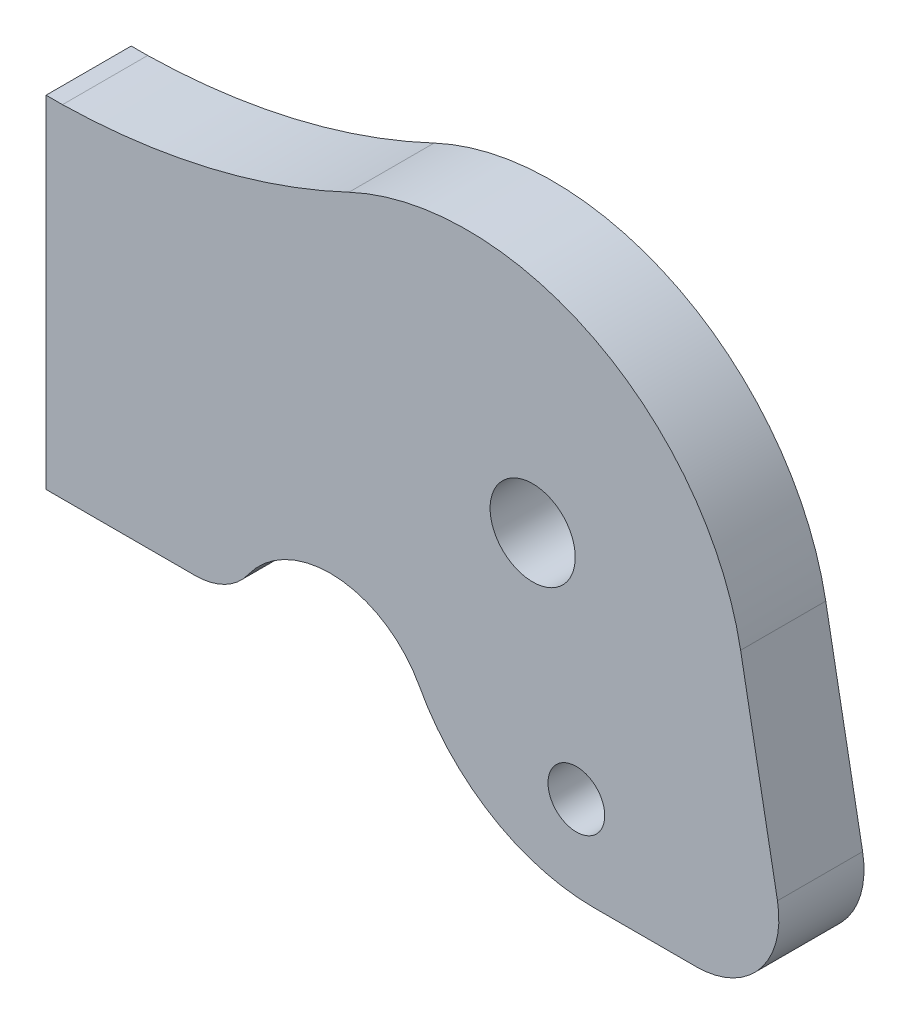
ISO-10303-21;
HEADER;
FILE_DESCRIPTION(('STEP AP214'),'2;1');
FILE_NAME('part.step','',(''),(''),'','','');
FILE_SCHEMA(('AUTOMOTIVE_DESIGN { 1 0 10303 214 1 1 1 1 }'));
ENDSEC;
DATA;
#1=APPLICATION_CONTEXT('core data for automotive mechanical design processes');
#2=APPLICATION_PROTOCOL_DEFINITION('international standard','automotive_design',2000,#1);
#3=PRODUCT_CONTEXT('',#1,'mechanical');
#4=PRODUCT('Part','Part','',(#3));
#5=PRODUCT_RELATED_PRODUCT_CATEGORY('part','',(#4));
#6=PRODUCT_DEFINITION_FORMATION('','',#4);
#7=PRODUCT_DEFINITION_CONTEXT('part definition',#1,'design');
#8=PRODUCT_DEFINITION('design','',#6,#7);
#9=PRODUCT_DEFINITION_SHAPE('','',#8);
#10=(LENGTH_UNIT() NAMED_UNIT(*) SI_UNIT(.MILLI.,.METRE.));
#11=(NAMED_UNIT(*) PLANE_ANGLE_UNIT() SI_UNIT($,.RADIAN.));
#12=(NAMED_UNIT(*) SI_UNIT($,.STERADIAN.) SOLID_ANGLE_UNIT());
#13=UNCERTAINTY_MEASURE_WITH_UNIT(LENGTH_MEASURE(1.E-05),#10,'distance_accuracy_value','');
#14=(GEOMETRIC_REPRESENTATION_CONTEXT(3) GLOBAL_UNCERTAINTY_ASSIGNED_CONTEXT((#13)) GLOBAL_UNIT_ASSIGNED_CONTEXT((#10,
#11,#12)) REPRESENTATION_CONTEXT('',''));
#15=CARTESIAN_POINT('',(0.,0.,0.));
#16=DIRECTION('',(0.,0.,1.));
#17=DIRECTION('',(1.,0.,0.));
#18=AXIS2_PLACEMENT_3D('',#15,#16,#17);
#19=CARTESIAN_POINT('',(-18.8116514005314,31.4423650959281,3.));
#20=DIRECTION('',(0.,0.,-1.));
#21=DIRECTION('',(-1.,0.,0.));
#22=AXIS2_PLACEMENT_3D('',#19,#20,#21);
#23=CYLINDRICAL_SURFACE('',#22,24.7241898311475);
#24=CARTESIAN_POINT('',(-18.8116514005314,31.4423650959281,0.));
#25=DIRECTION('',(0.,0.,1.));
#26=DIRECTION('',(1.,0.,0.));
#27=AXIS2_PLACEMENT_3D('',#24,#25,#26);
#28=CIRCLE('',#27,24.7241898311475);
#29=CARTESIAN_POINT('',(-18.3219339744752,6.72302571055551,0.));
#30=VERTEX_POINT('',#29);
#31=CARTESIAN_POINT('',(-8.23069141279537,9.09669776320907,0.));
#32=VERTEX_POINT('',#31);
#33=EDGE_CURVE('E152',#30,#32,#28,.T.);
#34=ORIENTED_EDGE('',*,*,#33,.F.);
#35=DIRECTION('',(0.,0.,-1.));
#36=VECTOR('',#35,1.);
#37=CARTESIAN_POINT('',(-18.3219339744752,6.72302571055551,3.));
#38=LINE('',#37,#36);
#39=CARTESIAN_POINT('',(-18.3219339744752,6.72302571055551,3.));
#40=VERTEX_POINT('',#39);
#41=EDGE_CURVE('E11',#40,#30,#38,.T.);
#42=ORIENTED_EDGE('',*,*,#41,.F.);
#43=CARTESIAN_POINT('',(-18.8116514005314,31.4423650959281,3.));
#44=DIRECTION('',(0.,0.,1.));
#45=DIRECTION('',(1.,0.,0.));
#46=AXIS2_PLACEMENT_3D('',#43,#44,#45);
#47=CIRCLE('',#46,24.7241898311475);
#48=CARTESIAN_POINT('',(-8.23069141279537,9.09669776320907,3.));
#49=VERTEX_POINT('',#48);
#50=EDGE_CURVE('E187',#40,#49,#47,.T.);
#51=ORIENTED_EDGE('',*,*,#50,.T.);
#52=DIRECTION('',(0.,0.,-1.));
#53=VECTOR('',#52,1.);
#54=CARTESIAN_POINT('',(-8.23069141279537,9.09669776320907,3.));
#55=LINE('',#54,#53);
#56=EDGE_CURVE('E50',#49,#32,#55,.T.);
#57=ORIENTED_EDGE('',*,*,#56,.T.);
#58=EDGE_LOOP('',(#34,#42,#51,#57));
#59=FACE_BOUND('',#58,.T.);
#60=ADVANCED_FACE('F34',(#59),#23,.F.);
#61=CARTESIAN_POINT('',(-2.81996856045021E-13,6.72302571055627,3.));
#62=DIRECTION('',(0.,1.,0.));
#63=DIRECTION('',(-1.,0.,0.));
#64=AXIS2_PLACEMENT_3D('',#61,#62,#63);
#65=PLANE('',#64);
#66=DIRECTION('',(1.,0.,0.));
#67=VECTOR('',#66,1.);
#68=CARTESIAN_POINT('',(-2.81996856045021E-13,6.72302571055627,0.));
#69=LINE('',#68,#67);
#70=CARTESIAN_POINT('',(-18.9009342857045,6.72302571055548,0.));
#71=VERTEX_POINT('',#70);
#72=EDGE_CURVE('E154',#71,#30,#69,.T.);
#73=ORIENTED_EDGE('',*,*,#72,.F.);
#74=DIRECTION('',(0.,0.,-1.));
#75=VECTOR('',#74,1.);
#76=CARTESIAN_POINT('',(-18.9009342857045,6.72302571055548,3.));
#77=LINE('',#76,#75);
#78=CARTESIAN_POINT('',(-18.9009342857045,6.72302571055548,3.));
#79=VERTEX_POINT('',#78);
#80=EDGE_CURVE('E42',#79,#71,#77,.T.);
#81=ORIENTED_EDGE('',*,*,#80,.F.);
#82=DIRECTION('',(1.,0.,0.));
#83=VECTOR('',#82,1.);
#84=CARTESIAN_POINT('',(-2.81996856045021E-13,6.72302571055627,3.));
#85=LINE('',#84,#83);
#86=EDGE_CURVE('E224',#79,#40,#85,.T.);
#87=ORIENTED_EDGE('',*,*,#86,.T.);
#88=ORIENTED_EDGE('',*,*,#41,.T.);
#89=EDGE_LOOP('',(#73,#81,#87,#88));
#90=FACE_BOUND('',#89,.T.);
#91=ADVANCED_FACE('F210',(#90),#65,.T.);
#92=CARTESIAN_POINT('',(-18.9009342857045,0.,3.));
#93=DIRECTION('',(-1.,0.,0.));
#94=DIRECTION('',(0.,-1.,0.));
#95=AXIS2_PLACEMENT_3D('',#92,#93,#94);
#96=PLANE('',#95);
#97=DIRECTION('',(0.,1.,0.));
#98=VECTOR('',#97,1.);
#99=CARTESIAN_POINT('',(-18.9009342857045,0.,0.));
#100=LINE('',#99,#98);
#101=CARTESIAN_POINT('',(-18.9009342857045,-5.30993656616223,0.));
#102=VERTEX_POINT('',#101);
#103=EDGE_CURVE('E157',#102,#71,#100,.T.);
#104=ORIENTED_EDGE('',*,*,#103,.F.);
#105=DIRECTION('',(0.,0.,-1.));
#106=VECTOR('',#105,1.);
#107=CARTESIAN_POINT('',(-18.9009342857045,-5.30993656616223,3.));
#108=LINE('',#107,#106);
#109=CARTESIAN_POINT('',(-18.9009342857045,-5.30993656616223,3.));
#110=VERTEX_POINT('',#109);
#111=EDGE_CURVE('E199',#110,#102,#108,.T.);
#112=ORIENTED_EDGE('',*,*,#111,.F.);
#113=DIRECTION('',(0.,1.,0.));
#114=VECTOR('',#113,1.);
#115=CARTESIAN_POINT('',(-18.9009342857045,0.,3.));
#116=LINE('',#115,#114);
#117=EDGE_CURVE('E206',#110,#79,#116,.T.);
#118=ORIENTED_EDGE('',*,*,#117,.T.);
#119=ORIENTED_EDGE('',*,*,#80,.T.);
#120=EDGE_LOOP('',(#104,#112,#118,#119));
#121=FACE_BOUND('',#120,.T.);
#122=ADVANCED_FACE('F204',(#121),#96,.T.);
#123=CARTESIAN_POINT('',(0.,-5.30993656616223,3.));
#124=DIRECTION('',(0.,-1.,0.));
#125=DIRECTION('',(1.,0.,0.));
#126=AXIS2_PLACEMENT_3D('',#123,#124,#125);
#127=PLANE('',#126);
#128=DIRECTION('',(-1.,0.,0.));
#129=VECTOR('',#128,1.);
#130=CARTESIAN_POINT('',(0.,-5.30993656616223,0.));
#131=LINE('',#130,#129);
#132=CARTESIAN_POINT('',(-13.6514223950237,-5.30993656616223,0.));
#133=VERTEX_POINT('',#132);
#134=EDGE_CURVE('E160',#133,#102,#131,.T.);
#135=ORIENTED_EDGE('',*,*,#134,.F.);
#136=DIRECTION('',(0.,0.,-1.));
#137=VECTOR('',#136,1.);
#138=CARTESIAN_POINT('',(-13.6514223950237,-5.30993656616223,3.));
#139=LINE('',#138,#137);
#140=CARTESIAN_POINT('',(-13.6514223950237,-5.30993656616223,3.));
#141=VERTEX_POINT('',#140);
#142=EDGE_CURVE('E197',#141,#133,#139,.T.);
#143=ORIENTED_EDGE('',*,*,#142,.F.);
#144=DIRECTION('',(-1.,0.,0.));
#145=VECTOR('',#144,1.);
#146=CARTESIAN_POINT('',(0.,-5.30993656616223,3.));
#147=LINE('',#146,#145);
#148=EDGE_CURVE('E221',#141,#110,#147,.T.);
#149=ORIENTED_EDGE('',*,*,#148,.T.);
#150=ORIENTED_EDGE('',*,*,#111,.T.);
#151=EDGE_LOOP('',(#135,#143,#149,#150));
#152=FACE_BOUND('',#151,.T.);
#153=ADVANCED_FACE('F218',(#152),#127,.T.);
#154=CARTESIAN_POINT('',(-13.6514223950237,-3.0133148483813,3.));
#155=DIRECTION('',(0.,0.,-1.));
#156=DIRECTION('',(-1.,0.,0.));
#157=AXIS2_PLACEMENT_3D('',#154,#155,#156);
#158=CYLINDRICAL_SURFACE('',#157,2.29662171778093);
#159=CARTESIAN_POINT('',(-13.6514223950237,-3.0133148483813,0.));
#160=DIRECTION('',(0.,0.,1.));
#161=DIRECTION('',(1.,0.,0.));
#162=AXIS2_PLACEMENT_3D('',#159,#160,#161);
#163=CIRCLE('',#162,2.29662171778093);
#164=CARTESIAN_POINT('',(-11.7827417395297,-4.34841930959977,0.));
#165=VERTEX_POINT('',#164);
#166=EDGE_CURVE('E163',#165,#133,#163,.F.);
#167=ORIENTED_EDGE('',*,*,#166,.F.);
#168=DIRECTION('',(0.,0.,-1.));
#169=VECTOR('',#168,1.);
#170=CARTESIAN_POINT('',(-11.7827417395297,-4.34841930959977,3.));
#171=LINE('',#170,#169);
#172=CARTESIAN_POINT('',(-11.7827417395297,-4.34841930959977,3.));
#173=VERTEX_POINT('',#172);
#174=EDGE_CURVE('E195',#173,#165,#171,.T.);
#175=ORIENTED_EDGE('',*,*,#174,.F.);
#176=CARTESIAN_POINT('',(-13.6514223950237,-3.0133148483813,3.));
#177=DIRECTION('',(0.,0.,1.));
#178=DIRECTION('',(1.,0.,0.));
#179=AXIS2_PLACEMENT_3D('',#176,#177,#178);
#180=CIRCLE('',#179,2.29662171778093);
#181=EDGE_CURVE('E226',#173,#141,#180,.F.);
#182=ORIENTED_EDGE('',*,*,#181,.T.);
#183=ORIENTED_EDGE('',*,*,#142,.T.);
#184=EDGE_LOOP('',(#167,#175,#182,#183));
#185=FACE_BOUND('',#184,.T.);
#186=ADVANCED_FACE('F265',(#185),#158,.T.);
#187=CARTESIAN_POINT('',(-8.88599586883723,-6.41803902959163,3.));
#188=DIRECTION('',(0.,0.,-1.));
#189=DIRECTION('',(-1.,0.,0.));
#190=AXIS2_PLACEMENT_3D('',#187,#188,#189);
#191=CYLINDRICAL_SURFACE('',#190,3.56012112501149);
#192=CARTESIAN_POINT('',(-8.88599586883723,-6.41803902959163,0.));
#193=DIRECTION('',(0.,0.,1.));
#194=DIRECTION('',(1.,0.,0.));
#195=AXIS2_PLACEMENT_3D('',#192,#193,#194);
#196=CIRCLE('',#195,3.56012112501149);
#197=CARTESIAN_POINT('',(-5.74914612924666,-4.73440126095383,0.));
#198=VERTEX_POINT('',#197);
#199=EDGE_CURVE('E166',#165,#198,#196,.F.);
#200=ORIENTED_EDGE('',*,*,#199,.T.);
#201=DIRECTION('',(0.,0.,-1.));
#202=VECTOR('',#201,1.);
#203=CARTESIAN_POINT('',(-5.74914612924666,-4.73440126095383,3.));
#204=LINE('',#203,#202);
#205=CARTESIAN_POINT('',(-5.74914612924666,-4.73440126095383,3.));
#206=VERTEX_POINT('',#205);
#207=EDGE_CURVE('E193',#206,#198,#204,.T.);
#208=ORIENTED_EDGE('',*,*,#207,.F.);
#209=CARTESIAN_POINT('',(-8.88599586883723,-6.41803902959163,3.));
#210=DIRECTION('',(0.,0.,1.));
#211=DIRECTION('',(1.,0.,0.));
#212=AXIS2_PLACEMENT_3D('',#209,#210,#211);
#213=CIRCLE('',#212,3.56012112501149);
#214=EDGE_CURVE('E232',#173,#206,#213,.F.);
#215=ORIENTED_EDGE('',*,*,#214,.F.);
#216=ORIENTED_EDGE('',*,*,#174,.T.);
#217=EDGE_LOOP('',(#200,#208,#215,#216));
#218=FACE_BOUND('',#217,.T.);
#219=ADVANCED_FACE('F268',(#218),#191,.F.);
#220=CARTESIAN_POINT('',(0.410473142212193,-1.42835586293264,3.));
#221=DIRECTION('',(0.,0.,-1.));
#222=DIRECTION('',(-1.,0.,0.));
#223=AXIS2_PLACEMENT_3D('',#220,#221,#222);
#224=CYLINDRICAL_SURFACE('',#223,6.99076860889447);
#225=CARTESIAN_POINT('',(0.410473142212193,-1.42835586293264,0.));
#226=DIRECTION('',(0.,0.,1.));
#227=DIRECTION('',(1.,0.,0.));
#228=AXIS2_PLACEMENT_3D('',#225,#226,#227);
#229=CIRCLE('',#228,6.99076860889447);
#230=CARTESIAN_POINT('',(0.410473142212194,-8.41912447182711,0.));
#231=VERTEX_POINT('',#230);
#232=EDGE_CURVE('E169',#231,#198,#229,.F.);
#233=ORIENTED_EDGE('',*,*,#232,.F.);
#234=DIRECTION('',(0.,0.,-1.));
#235=VECTOR('',#234,1.);
#236=CARTESIAN_POINT('',(0.410473142212194,-8.41912447182711,3.));
#237=LINE('',#236,#235);
#238=CARTESIAN_POINT('',(0.410473142212194,-8.41912447182711,3.));
#239=VERTEX_POINT('',#238);
#240=EDGE_CURVE('E191',#239,#231,#237,.T.);
#241=ORIENTED_EDGE('',*,*,#240,.F.);
#242=CARTESIAN_POINT('',(0.410473142212193,-1.42835586293264,3.));
#243=DIRECTION('',(0.,0.,1.));
#244=DIRECTION('',(1.,0.,0.));
#245=AXIS2_PLACEMENT_3D('',#242,#243,#244);
#246=CIRCLE('',#245,6.99076860889447);
#247=EDGE_CURVE('E234',#239,#206,#246,.F.);
#248=ORIENTED_EDGE('',*,*,#247,.T.);
#249=ORIENTED_EDGE('',*,*,#207,.T.);
#250=EDGE_LOOP('',(#233,#241,#248,#249));
#251=FACE_BOUND('',#250,.T.);
#252=ADVANCED_FACE('F272',(#251),#224,.T.);
#253=CARTESIAN_POINT('',(0.,-8.41912447182711,3.));
#254=DIRECTION('',(0.,-1.,0.));
#255=DIRECTION('',(1.,0.,0.));
#256=AXIS2_PLACEMENT_3D('',#253,#254,#255);
#257=PLANE('',#256);
#258=DIRECTION('',(-1.,0.,0.));
#259=VECTOR('',#258,1.);
#260=CARTESIAN_POINT('',(0.,-8.41912447182711,0.));
#261=LINE('',#260,#259);
#262=CARTESIAN_POINT('',(4.00499964816866,-8.41912447182711,0.));
#263=VERTEX_POINT('',#262);
#264=EDGE_CURVE('E172',#263,#231,#261,.T.);
#265=ORIENTED_EDGE('',*,*,#264,.F.);
#266=DIRECTION('',(0.,0.,-1.));
#267=VECTOR('',#266,1.);
#268=CARTESIAN_POINT('',(4.00499964816866,-8.41912447182711,3.));
#269=LINE('',#268,#267);
#270=CARTESIAN_POINT('',(4.00499964816866,-8.41912447182711,3.));
#271=VERTEX_POINT('',#270);
#272=EDGE_CURVE('E127',#271,#263,#269,.T.);
#273=ORIENTED_EDGE('',*,*,#272,.F.);
#274=DIRECTION('',(-1.,0.,0.));
#275=VECTOR('',#274,1.);
#276=CARTESIAN_POINT('',(0.,-8.41912447182711,3.));
#277=LINE('',#276,#275);
#278=EDGE_CURVE('E138',#271,#239,#277,.T.);
#279=ORIENTED_EDGE('',*,*,#278,.T.);
#280=ORIENTED_EDGE('',*,*,#240,.T.);
#281=EDGE_LOOP('',(#265,#273,#279,#280));
#282=FACE_BOUND('',#281,.T.);
#283=ADVANCED_FACE('F238',(#282),#257,.T.);
#284=CARTESIAN_POINT('',(4.00499964816866,-5.5059911882614,3.));
#285=DIRECTION('',(0.,0.,-1.));
#286=DIRECTION('',(-1.,0.,0.));
#287=AXIS2_PLACEMENT_3D('',#284,#285,#286);
#288=CYLINDRICAL_SURFACE('',#287,2.91313328356571);
#289=CARTESIAN_POINT('',(4.00499964816866,-5.5059911882614,0.));
#290=DIRECTION('',(0.,0.,1.));
#291=DIRECTION('',(1.,0.,0.));
#292=AXIS2_PLACEMENT_3D('',#289,#290,#291);
#293=CIRCLE('',#292,2.91313328356571);
#294=CARTESIAN_POINT('',(6.86915237543381,-4.97403754110976,0.));
#295=VERTEX_POINT('',#294);
#296=EDGE_CURVE('E123',#295,#263,#293,.F.);
#297=ORIENTED_EDGE('',*,*,#296,.F.);
#298=DIRECTION('',(0.,0.,-1.));
#299=VECTOR('',#298,1.);
#300=CARTESIAN_POINT('',(6.86915237543381,-4.97403754110976,3.));
#301=LINE('',#300,#299);
#302=CARTESIAN_POINT('',(6.86915237543381,-4.97403754110976,3.));
#303=VERTEX_POINT('',#302);
#304=EDGE_CURVE('E118',#303,#295,#301,.T.);
#305=ORIENTED_EDGE('',*,*,#304,.F.);
#306=CARTESIAN_POINT('',(4.00499964816866,-5.5059911882614,3.));
#307=DIRECTION('',(0.,0.,1.));
#308=DIRECTION('',(1.,0.,0.));
#309=AXIS2_PLACEMENT_3D('',#306,#307,#308);
#310=CIRCLE('',#309,2.91313328356571);
#311=EDGE_CURVE('E121',#303,#271,#310,.F.);
#312=ORIENTED_EDGE('',*,*,#311,.T.);
#313=ORIENTED_EDGE('',*,*,#272,.T.);
#314=EDGE_LOOP('',(#297,#305,#312,#313));
#315=FACE_BOUND('',#314,.T.);
#316=ADVANCED_FACE('F120',(#315),#288,.T.);
#317=CARTESIAN_POINT('',(5.74708842954713,1.06739582058522,3.));
#318=DIRECTION('',(0.983186297524772,0.182605324017486,0.));
#319=DIRECTION('',(-0.182605324017486,0.983186297524772,0.));
#320=AXIS2_PLACEMENT_3D('',#317,#318,#319);
#321=PLANE('',#320);
#322=DIRECTION('',(0.182605324017486,-0.983186297524772,0.));
#323=VECTOR('',#322,1.);
#324=CARTESIAN_POINT('',(5.74708842954713,1.06739582058522,0.));
#325=LINE('',#324,#323);
#326=CARTESIAN_POINT('',(5.57003257341053,2.02070259072819,0.));
#327=VERTEX_POINT('',#326);
#328=EDGE_CURVE('E176',#327,#295,#325,.T.);
#329=ORIENTED_EDGE('',*,*,#328,.F.);
#330=DIRECTION('',(0.,0.,-1.));
#331=VECTOR('',#330,1.);
#332=CARTESIAN_POINT('',(5.57003257341053,2.02070259072819,3.));
#333=LINE('',#332,#331);
#334=CARTESIAN_POINT('',(5.57003257341053,2.02070259072819,3.));
#335=VERTEX_POINT('',#334);
#336=EDGE_CURVE('E84',#335,#327,#333,.T.);
#337=ORIENTED_EDGE('',*,*,#336,.F.);
#338=DIRECTION('',(0.182605324017486,-0.983186297524772,0.));
#339=VECTOR('',#338,1.);
#340=CARTESIAN_POINT('',(5.74708842954713,1.06739582058522,3.));
#341=LINE('',#340,#339);
#342=EDGE_CURVE('E135',#335,#303,#341,.T.);
#343=ORIENTED_EDGE('',*,*,#342,.T.);
#344=ORIENTED_EDGE('',*,*,#304,.T.);
#345=EDGE_LOOP('',(#329,#337,#343,#344));
#346=FACE_BOUND('',#345,.T.);
#347=ADVANCED_FACE('F140',(#346),#321,.T.);
#348=CARTESIAN_POINT('',(-0.21671736200531,-5.41912447182711,3.));
#349=DIRECTION('',(0.,0.,-1.));
#350=DIRECTION('',(-1.,0.,0.));
#351=AXIS2_PLACEMENT_3D('',#348,#349,#350);
#352=CYLINDRICAL_SURFACE('',#351,1.);
#353=CARTESIAN_POINT('',(-0.21671736200531,-5.41912447182711,3.));
#354=DIRECTION('',(0.,0.,1.));
#355=DIRECTION('',(1.,0.,0.));
#356=AXIS2_PLACEMENT_3D('',#353,#354,#355);
#357=CIRCLE('',#356,1.);
#358=CARTESIAN_POINT('',(0.783282637994691,-5.41912447182711,3.));
#359=VERTEX_POINT('',#358);
#360=EDGE_CURVE('E143',#359,#359,#357,.T.);
#361=ORIENTED_EDGE('',*,*,#360,.T.);
#362=EDGE_LOOP('',(#361));
#363=FACE_BOUND('',#362,.T.);
#364=CARTESIAN_POINT('',(-0.21671736200531,-5.41912447182711,0.));
#365=DIRECTION('',(0.,0.,1.));
#366=DIRECTION('',(1.,0.,0.));
#367=AXIS2_PLACEMENT_3D('',#364,#365,#366);
#368=CIRCLE('',#367,1.);
#369=CARTESIAN_POINT('',(0.783282637994691,-5.41912447182711,0.));
#370=VERTEX_POINT('',#369);
#371=EDGE_CURVE('E181',#370,#370,#368,.T.);
#372=ORIENTED_EDGE('',*,*,#371,.F.);
#373=EDGE_LOOP('',(#372));
#374=FACE_BOUND('',#373,.T.);
#375=ADVANCED_FACE('F243',(#363,#374),#352,.F.);
#376=CARTESIAN_POINT('',(-4.06154724838175,0.231847560316959,3.));
#377=DIRECTION('',(0.,0.,-1.));
#378=DIRECTION('',(-1.,0.,0.));
#379=AXIS2_PLACEMENT_3D('',#376,#377,#378);
#380=CYLINDRICAL_SURFACE('',#379,9.79629175675064);
#381=CARTESIAN_POINT('',(-4.06154724838175,0.231847560316959,0.));
#382=DIRECTION('',(0.,0.,1.));
#383=DIRECTION('',(1.,0.,0.));
#384=AXIS2_PLACEMENT_3D('',#381,#382,#383);
#385=CIRCLE('',#384,9.79629175675064);
#386=EDGE_CURVE('E178',#32,#327,#385,.F.);
#387=ORIENTED_EDGE('',*,*,#386,.F.);
#388=ORIENTED_EDGE('',*,*,#56,.F.);
#389=CARTESIAN_POINT('',(-4.06154724838175,0.231847560316959,3.));
#390=DIRECTION('',(0.,0.,1.));
#391=DIRECTION('',(1.,0.,0.));
#392=AXIS2_PLACEMENT_3D('',#389,#390,#391);
#393=CIRCLE('',#392,9.79629175675064);
#394=EDGE_CURVE('E141',#49,#335,#393,.F.);
#395=ORIENTED_EDGE('',*,*,#394,.T.);
#396=ORIENTED_EDGE('',*,*,#336,.T.);
#397=EDGE_LOOP('',(#387,#388,#395,#396));
#398=FACE_BOUND('',#397,.T.);
#399=ADVANCED_FACE('F240',(#398),#380,.T.);
#400=CARTESIAN_POINT('',(-1.75671736200531,1.94087552817289,3.));
#401=DIRECTION('',(0.,0.,-1.));
#402=DIRECTION('',(-1.,0.,0.));
#403=AXIS2_PLACEMENT_3D('',#400,#401,#402);
#404=CYLINDRICAL_SURFACE('',#403,1.5);
#405=CARTESIAN_POINT('',(-1.75671736200531,1.94087552817289,3.));
#406=DIRECTION('',(0.,0.,1.));
#407=DIRECTION('',(1.,0.,0.));
#408=AXIS2_PLACEMENT_3D('',#405,#406,#407);
#409=CIRCLE('',#408,1.5);
#410=CARTESIAN_POINT('',(-0.256717362005311,1.94087552817289,3.));
#411=VERTEX_POINT('',#410);
#412=EDGE_CURVE('E149',#411,#411,#409,.T.);
#413=ORIENTED_EDGE('',*,*,#412,.T.);
#414=EDGE_LOOP('',(#413));
#415=FACE_BOUND('',#414,.T.);
#416=CARTESIAN_POINT('',(-1.75671736200531,1.94087552817289,0.));
#417=DIRECTION('',(0.,0.,1.));
#418=DIRECTION('',(1.,0.,0.));
#419=AXIS2_PLACEMENT_3D('',#416,#417,#418);
#420=CIRCLE('',#419,1.5);
#421=CARTESIAN_POINT('',(-0.256717362005311,1.94087552817289,0.));
#422=VERTEX_POINT('',#421);
#423=EDGE_CURVE('E184',#422,#422,#420,.T.);
#424=ORIENTED_EDGE('',*,*,#423,.F.);
#425=EDGE_LOOP('',(#424));
#426=FACE_BOUND('',#425,.T.);
#427=ADVANCED_FACE('F242',(#415,#426),#404,.F.);
#428=CARTESIAN_POINT('',(0.,0.,3.));
#429=DIRECTION('',(0.,0.,1.));
#430=DIRECTION('',(1.,0.,0.));
#431=AXIS2_PLACEMENT_3D('',#428,#429,#430);
#432=PLANE('',#431);
#433=ORIENTED_EDGE('',*,*,#50,.F.);
#434=ORIENTED_EDGE('',*,*,#86,.F.);
#435=ORIENTED_EDGE('',*,*,#117,.F.);
#436=ORIENTED_EDGE('',*,*,#148,.F.);
#437=ORIENTED_EDGE('',*,*,#181,.F.);
#438=ORIENTED_EDGE('',*,*,#214,.T.);
#439=ORIENTED_EDGE('',*,*,#247,.F.);
#440=ORIENTED_EDGE('',*,*,#278,.F.);
#441=ORIENTED_EDGE('',*,*,#311,.F.);
#442=ORIENTED_EDGE('',*,*,#342,.F.);
#443=ORIENTED_EDGE('',*,*,#394,.F.);
#444=EDGE_LOOP('',(#433,#434,#435,#436,#437,#438,#439,#440,#441,#442,#443));
#445=FACE_BOUND('',#444,.T.);
#446=ORIENTED_EDGE('',*,*,#360,.F.);
#447=EDGE_LOOP('',(#446));
#448=FACE_BOUND('',#447,.T.);
#449=ORIENTED_EDGE('',*,*,#412,.F.);
#450=EDGE_LOOP('',(#449));
#451=FACE_BOUND('',#450,.T.);
#452=ADVANCED_FACE('F132',(#445,#448,#451),#432,.T.);
#453=CARTESIAN_POINT('',(0.,0.,0.));
#454=DIRECTION('',(0.,0.,1.));
#455=DIRECTION('',(1.,0.,0.));
#456=AXIS2_PLACEMENT_3D('',#453,#454,#455);
#457=PLANE('',#456);
#458=ORIENTED_EDGE('',*,*,#33,.T.);
#459=ORIENTED_EDGE('',*,*,#386,.T.);
#460=ORIENTED_EDGE('',*,*,#328,.T.);
#461=ORIENTED_EDGE('',*,*,#296,.T.);
#462=ORIENTED_EDGE('',*,*,#264,.T.);
#463=ORIENTED_EDGE('',*,*,#232,.T.);
#464=ORIENTED_EDGE('',*,*,#199,.F.);
#465=ORIENTED_EDGE('',*,*,#166,.T.);
#466=ORIENTED_EDGE('',*,*,#134,.T.);
#467=ORIENTED_EDGE('',*,*,#103,.T.);
#468=ORIENTED_EDGE('',*,*,#72,.T.);
#469=EDGE_LOOP('',(#458,#459,#460,#461,#462,#463,#464,#465,#466,#467,#468));
#470=FACE_BOUND('',#469,.T.);
#471=ORIENTED_EDGE('',*,*,#371,.T.);
#472=EDGE_LOOP('',(#471));
#473=FACE_BOUND('',#472,.T.);
#474=ORIENTED_EDGE('',*,*,#423,.T.);
#475=EDGE_LOOP('',(#474));
#476=FACE_BOUND('',#475,.T.);
#477=ADVANCED_FACE('F212',(#470,#473,#476),#457,.F.);
#478=CLOSED_SHELL('',(#60,#91,#122,#153,#186,#219,#252,#283,#316,#347,#375,#399,#427,#452,#477));
#479=MANIFOLD_SOLID_BREP('B2',#478);
#480=ADVANCED_BREP_SHAPE_REPRESENTATION('',(#18,#479),#14);
#481=SHAPE_DEFINITION_REPRESENTATION(#9,#480);
ENDSEC;
END-ISO-10303-21;
